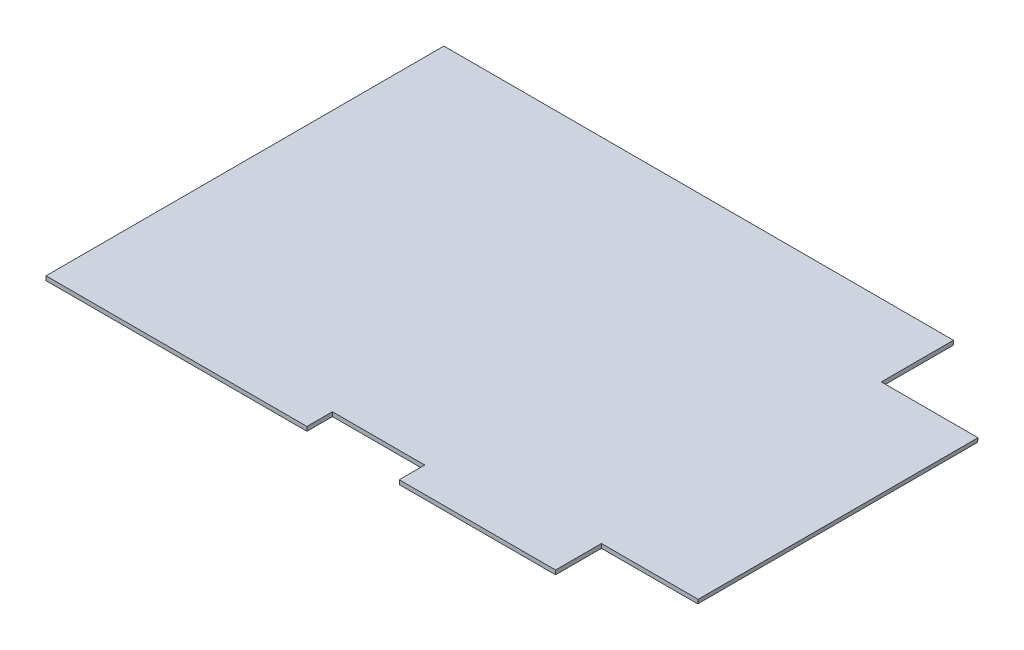
ISO-10303-21;
HEADER;
FILE_DESCRIPTION(('STEP AP214'),'2;1');
FILE_NAME('part.step','',(''),(''),'','','');
FILE_SCHEMA(('AUTOMOTIVE_DESIGN { 1 0 10303 214 1 1 1 1 }'));
ENDSEC;
DATA;
#1=APPLICATION_CONTEXT('core data for automotive mechanical design processes');
#2=APPLICATION_PROTOCOL_DEFINITION('international standard','automotive_design',2000,#1);
#3=PRODUCT_CONTEXT('',#1,'mechanical');
#4=PRODUCT('Part','Part','',(#3));
#5=PRODUCT_RELATED_PRODUCT_CATEGORY('part','',(#4));
#6=PRODUCT_DEFINITION_FORMATION('','',#4);
#7=PRODUCT_DEFINITION_CONTEXT('part definition',#1,'design');
#8=PRODUCT_DEFINITION('design','',#6,#7);
#9=PRODUCT_DEFINITION_SHAPE('','',#8);
#10=(LENGTH_UNIT() NAMED_UNIT(*) SI_UNIT(.MILLI.,.METRE.));
#11=(NAMED_UNIT(*) PLANE_ANGLE_UNIT() SI_UNIT($,.RADIAN.));
#12=(NAMED_UNIT(*) SI_UNIT($,.STERADIAN.) SOLID_ANGLE_UNIT());
#13=UNCERTAINTY_MEASURE_WITH_UNIT(LENGTH_MEASURE(1.E-05),#10,'distance_accuracy_value','');
#14=(GEOMETRIC_REPRESENTATION_CONTEXT(3) GLOBAL_UNCERTAINTY_ASSIGNED_CONTEXT((#13)) GLOBAL_UNIT_ASSIGNED_CONTEXT((#10,
#11,#12)) REPRESENTATION_CONTEXT('',''));
#15=CARTESIAN_POINT('',(0.,0.,0.));
#16=DIRECTION('',(0.,0.,1.));
#17=DIRECTION('',(1.,0.,0.));
#18=AXIS2_PLACEMENT_3D('',#15,#16,#17);
#19=CARTESIAN_POINT('',(0.,0.,91.));
#20=DIRECTION('',(0.,0.,1.));
#21=DIRECTION('',(1.,0.,0.));
#22=AXIS2_PLACEMENT_3D('',#19,#20,#21);
#23=PLANE('',#22);
#24=DIRECTION('',(0.,1.,0.));
#25=VECTOR('',#24,1.);
#26=CARTESIAN_POINT('',(26.9504804762211,-14.6783379848463,91.));
#27=LINE('',#26,#25);
#28=CARTESIAN_POINT('',(26.9504804762211,-5.6411425591385,91.));
#29=VERTEX_POINT('',#28);
#30=CARTESIAN_POINT('',(26.9504804762211,-4.67833798484632,91.));
#31=VERTEX_POINT('',#30);
#32=EDGE_CURVE('E149',#29,#31,#27,.T.);
#33=ORIENTED_EDGE('',*,*,#32,.F.);
#34=DIRECTION('',(1.,0.,0.));
#35=VECTOR('',#34,1.);
#36=CARTESIAN_POINT('',(0.,-5.6411425591385,91.));
#37=LINE('',#36,#35);
#38=CARTESIAN_POINT('',(62.6929174042532,-5.6411425591385,91.));
#39=VERTEX_POINT('',#38);
#40=EDGE_CURVE('E159',#29,#39,#37,.T.);
#41=ORIENTED_EDGE('',*,*,#40,.T.);
#42=DIRECTION('',(0.,-1.,0.));
#43=VECTOR('',#42,1.);
#44=CARTESIAN_POINT('',(62.6929174042532,0.,91.));
#45=LINE('',#44,#43);
#46=CARTESIAN_POINT('',(62.6929174042532,-4.67833798484632,91.));
#47=VERTEX_POINT('',#46);
#48=EDGE_CURVE('E184',#47,#39,#45,.T.);
#49=ORIENTED_EDGE('',*,*,#48,.F.);
#50=DIRECTION('',(1.,0.,0.));
#51=VECTOR('',#50,1.);
#52=CARTESIAN_POINT('',(0.,-4.67833798484632,91.));
#53=LINE('',#52,#51);
#54=EDGE_CURVE('E157',#31,#47,#53,.T.);
#55=ORIENTED_EDGE('',*,*,#54,.F.);
#56=EDGE_LOOP('',(#33,#41,#49,#55));
#57=FACE_BOUND('',#56,.T.);
#58=ADVANCED_FACE('F35',(#57),#23,.T.);
#59=CARTESIAN_POINT('',(0.,-4.67833798484632,91.));
#60=DIRECTION('',(0.,1.,0.));
#61=DIRECTION('',(0.,0.,1.));
#62=AXIS2_PLACEMENT_3D('',#59,#60,#61);
#63=PLANE('',#62);
#64=DIRECTION('',(-0.00813356916873561,0.,-0.999966921979211));
#65=VECTOR('',#64,1.);
#66=CARTESIAN_POINT('',(26.9504804762211,-4.67833798484632,91.));
#67=LINE('',#66,#65);
#68=CARTESIAN_POINT('',(26.9382797188911,-4.67833798484632,89.5));
#69=VERTEX_POINT('',#68);
#70=EDGE_CURVE('E150',#31,#69,#67,.T.);
#71=ORIENTED_EDGE('',*,*,#70,.F.);
#72=ORIENTED_EDGE('',*,*,#54,.T.);
#73=DIRECTION('',(0.,0.,1.));
#74=VECTOR('',#73,1.);
#75=CARTESIAN_POINT('',(62.6929174042532,-4.67833798484632,94.5));
#76=LINE('',#75,#74);
#77=CARTESIAN_POINT('',(62.6929174042532,-4.67833798484632,80.5));
#78=VERTEX_POINT('',#77);
#79=EDGE_CURVE('E221',#78,#47,#76,.T.);
#80=ORIENTED_EDGE('',*,*,#79,.F.);
#81=DIRECTION('',(-1.,0.,0.));
#82=VECTOR('',#81,1.);
#83=CARTESIAN_POINT('',(92.8153903754205,-4.67833798484632,80.5));
#84=LINE('',#83,#82);
#85=CARTESIAN_POINT('',(84.8047320824321,-4.67833798484632,80.5));
#86=VERTEX_POINT('',#85);
#87=EDGE_CURVE('E218',#86,#78,#84,.T.);
#88=ORIENTED_EDGE('',*,*,#87,.F.);
#89=DIRECTION('',(0.,0.,-1.));
#90=VECTOR('',#89,1.);
#91=CARTESIAN_POINT('',(84.8047320824321,-4.67833798484632,91.));
#92=LINE('',#91,#90);
#93=CARTESIAN_POINT('',(84.8047320824321,-4.67833798484632,16.5));
#94=VERTEX_POINT('',#93);
#95=EDGE_CURVE('E167',#86,#94,#92,.T.);
#96=ORIENTED_EDGE('',*,*,#95,.T.);
#97=DIRECTION('',(1.,0.,0.));
#98=VECTOR('',#97,1.);
#99=CARTESIAN_POINT('',(62.6929174042532,-4.67833798484632,16.5));
#100=LINE('',#99,#98);
#101=CARTESIAN_POINT('',(62.6929174042532,-4.67833798484632,16.5));
#102=VERTEX_POINT('',#101);
#103=EDGE_CURVE('E213',#102,#94,#100,.T.);
#104=ORIENTED_EDGE('',*,*,#103,.F.);
#105=DIRECTION('',(0.,0.,1.));
#106=VECTOR('',#105,1.);
#107=CARTESIAN_POINT('',(62.6929174042532,-4.67833798484632,2.49999999999999));
#108=LINE('',#107,#106);
#109=CARTESIAN_POINT('',(62.6929174042532,-4.67833798484632,0.));
#110=VERTEX_POINT('',#109);
#111=EDGE_CURVE('E210',#110,#102,#108,.T.);
#112=ORIENTED_EDGE('',*,*,#111,.F.);
#113=DIRECTION('',(1.,0.,0.));
#114=VECTOR('',#113,1.);
#115=CARTESIAN_POINT('',(0.,-4.67833798484632,0.));
#116=LINE('',#115,#114);
#117=CARTESIAN_POINT('',(-53.8398515265044,-4.67833798484632,0.));
#118=VERTEX_POINT('',#117);
#119=EDGE_CURVE('E168',#118,#110,#116,.T.);
#120=ORIENTED_EDGE('',*,*,#119,.F.);
#121=DIRECTION('',(0.,0.,-1.));
#122=VECTOR('',#121,1.);
#123=CARTESIAN_POINT('',(-53.8398515265044,-4.67833798484632,91.));
#124=LINE('',#123,#122);
#125=CARTESIAN_POINT('',(-53.8398515265044,-4.67833798484632,91.));
#126=VERTEX_POINT('',#125);
#127=EDGE_CURVE('E154',#126,#118,#124,.T.);
#128=ORIENTED_EDGE('',*,*,#127,.F.);
#129=CARTESIAN_POINT('',(5.83223887179792,-4.67833798484632,91.));
#130=VERTEX_POINT('',#129);
#131=EDGE_CURVE('E146',#126,#130,#53,.T.);
#132=ORIENTED_EDGE('',*,*,#131,.T.);
#133=DIRECTION('',(0.,0.,1.));
#134=VECTOR('',#133,1.);
#135=CARTESIAN_POINT('',(5.83223887179792,-4.67833798484632,89.5));
#136=LINE('',#135,#134);
#137=CARTESIAN_POINT('',(5.83223887179792,-4.67833798484632,85.1692979934994));
#138=VERTEX_POINT('',#137);
#139=EDGE_CURVE('E132',#138,#130,#136,.T.);
#140=ORIENTED_EDGE('',*,*,#139,.F.);
#141=DIRECTION('',(-1.,0.,0.));
#142=VECTOR('',#141,1.);
#143=CARTESIAN_POINT('',(26.9382797188911,-4.67833798484632,85.1692979934994));
#144=LINE('',#143,#142);
#145=CARTESIAN_POINT('',(26.9382797188911,-4.67833798484632,85.1692979934994));
#146=VERTEX_POINT('',#145);
#147=EDGE_CURVE('E141',#146,#138,#144,.T.);
#148=ORIENTED_EDGE('',*,*,#147,.F.);
#149=DIRECTION('',(0.,0.,-1.));
#150=VECTOR('',#149,1.);
#151=CARTESIAN_POINT('',(26.9382797188911,-4.67833798484632,89.5));
#152=LINE('',#151,#150);
#153=EDGE_CURVE('E50',#69,#146,#152,.T.);
#154=ORIENTED_EDGE('',*,*,#153,.F.);
#155=EDGE_LOOP('',(#71,#72,#80,#88,#96,#104,#112,#120,#128,#132,#140,#148,#154));
#156=FACE_BOUND('',#155,.T.);
#157=ADVANCED_FACE('F37',(#156),#63,.T.);
#158=CARTESIAN_POINT('',(-53.8398515265044,0.,91.));
#159=DIRECTION('',(1.,0.,0.));
#160=DIRECTION('',(0.,0.,-1.));
#161=AXIS2_PLACEMENT_3D('',#158,#159,#160);
#162=PLANE('',#161);
#163=DIRECTION('',(0.,-1.,0.));
#164=VECTOR('',#163,1.);
#165=CARTESIAN_POINT('',(-53.8398515265044,0.,0.));
#166=LINE('',#165,#164);
#167=CARTESIAN_POINT('',(-53.8398515265044,-5.6411425591385,0.));
#168=VERTEX_POINT('',#167);
#169=EDGE_CURVE('E171',#118,#168,#166,.T.);
#170=ORIENTED_EDGE('',*,*,#169,.T.);
#171=DIRECTION('',(0.,0.,-1.));
#172=VECTOR('',#171,1.);
#173=CARTESIAN_POINT('',(-53.8398515265044,-5.6411425591385,91.));
#174=LINE('',#173,#172);
#175=CARTESIAN_POINT('',(-53.8398515265044,-5.6411425591385,91.));
#176=VERTEX_POINT('',#175);
#177=EDGE_CURVE('E180',#176,#168,#174,.T.);
#178=ORIENTED_EDGE('',*,*,#177,.F.);
#179=DIRECTION('',(0.,-1.,0.));
#180=VECTOR('',#179,1.);
#181=CARTESIAN_POINT('',(-53.8398515265044,0.,91.));
#182=LINE('',#181,#180);
#183=EDGE_CURVE('E156',#126,#176,#182,.T.);
#184=ORIENTED_EDGE('',*,*,#183,.F.);
#185=ORIENTED_EDGE('',*,*,#127,.T.);
#186=EDGE_LOOP('',(#170,#178,#184,#185));
#187=FACE_BOUND('',#186,.T.);
#188=ADVANCED_FACE('F271',(#187),#162,.F.);
#189=CARTESIAN_POINT('',(0.,-5.6411425591385,91.));
#190=DIRECTION('',(0.,1.,0.));
#191=DIRECTION('',(0.,0.,1.));
#192=AXIS2_PLACEMENT_3D('',#189,#190,#191);
#193=PLANE('',#192);
#194=ORIENTED_EDGE('',*,*,#40,.F.);
#195=DIRECTION('',(-0.00813356916873561,0.,-0.999966921979211));
#196=VECTOR('',#195,1.);
#197=CARTESIAN_POINT('',(26.9486975686021,-5.6411425591385,90.7808036537371));
#198=LINE('',#197,#196);
#199=CARTESIAN_POINT('',(26.9382797188911,-5.6411425591385,89.5));
#200=VERTEX_POINT('',#199);
#201=EDGE_CURVE('E249',#29,#200,#198,.T.);
#202=ORIENTED_EDGE('',*,*,#201,.T.);
#203=DIRECTION('',(0.,0.,-1.));
#204=VECTOR('',#203,1.);
#205=CARTESIAN_POINT('',(26.9382797188911,-5.6411425591385,91.));
#206=LINE('',#205,#204);
#207=CARTESIAN_POINT('',(26.9382797188911,-5.6411425591385,85.1692979934994));
#208=VERTEX_POINT('',#207);
#209=EDGE_CURVE('E11',#200,#208,#206,.T.);
#210=ORIENTED_EDGE('',*,*,#209,.T.);
#211=DIRECTION('',(-1.,0.,0.));
#212=VECTOR('',#211,1.);
#213=CARTESIAN_POINT('',(0.,-5.6411425591385,85.1692979934994));
#214=LINE('',#213,#212);
#215=CARTESIAN_POINT('',(5.83223887179792,-5.6411425591385,85.1692979934994));
#216=VERTEX_POINT('',#215);
#217=EDGE_CURVE('E196',#208,#216,#214,.T.);
#218=ORIENTED_EDGE('',*,*,#217,.T.);
#219=DIRECTION('',(0.,0.,1.));
#220=VECTOR('',#219,1.);
#221=CARTESIAN_POINT('',(5.83223887179792,-5.6411425591385,91.));
#222=LINE('',#221,#220);
#223=CARTESIAN_POINT('',(5.83223887179792,-5.6411425591385,91.));
#224=VERTEX_POINT('',#223);
#225=EDGE_CURVE('E43',#216,#224,#222,.T.);
#226=ORIENTED_EDGE('',*,*,#225,.T.);
#227=EDGE_CURVE('E148',#176,#224,#37,.T.);
#228=ORIENTED_EDGE('',*,*,#227,.F.);
#229=ORIENTED_EDGE('',*,*,#177,.T.);
#230=DIRECTION('',(1.,0.,0.));
#231=VECTOR('',#230,1.);
#232=CARTESIAN_POINT('',(0.,-5.6411425591385,0.));
#233=LINE('',#232,#231);
#234=CARTESIAN_POINT('',(62.6929174042532,-5.6411425591385,0.));
#235=VERTEX_POINT('',#234);
#236=EDGE_CURVE('E161',#168,#235,#233,.T.);
#237=ORIENTED_EDGE('',*,*,#236,.T.);
#238=DIRECTION('',(0.,0.,1.));
#239=VECTOR('',#238,1.);
#240=CARTESIAN_POINT('',(62.6929174042532,-5.6411425591385,91.));
#241=LINE('',#240,#239);
#242=CARTESIAN_POINT('',(62.6929174042532,-5.6411425591385,16.5));
#243=VERTEX_POINT('',#242);
#244=EDGE_CURVE('E193',#235,#243,#241,.T.);
#245=ORIENTED_EDGE('',*,*,#244,.T.);
#246=DIRECTION('',(1.,0.,0.));
#247=VECTOR('',#246,1.);
#248=CARTESIAN_POINT('',(0.,-5.6411425591385,16.5));
#249=LINE('',#248,#247);
#250=CARTESIAN_POINT('',(84.7089553799947,-5.6411425591385,16.5));
#251=VERTEX_POINT('',#250);
#252=EDGE_CURVE('E163',#243,#251,#249,.T.);
#253=ORIENTED_EDGE('',*,*,#252,.T.);
#254=DIRECTION('',(0.,0.,-1.));
#255=VECTOR('',#254,1.);
#256=CARTESIAN_POINT('',(84.7089553799947,-5.6411425591385,91.));
#257=LINE('',#256,#255);
#258=CARTESIAN_POINT('',(84.7089553799947,-5.6411425591385,80.5));
#259=VERTEX_POINT('',#258);
#260=EDGE_CURVE('E177',#259,#251,#257,.T.);
#261=ORIENTED_EDGE('',*,*,#260,.F.);
#262=DIRECTION('',(-1.,0.,0.));
#263=VECTOR('',#262,1.);
#264=CARTESIAN_POINT('',(0.,-5.6411425591385,80.5));
#265=LINE('',#264,#263);
#266=CARTESIAN_POINT('',(62.6929174042532,-5.6411425591385,80.5));
#267=VERTEX_POINT('',#266);
#268=EDGE_CURVE('E228',#259,#267,#265,.T.);
#269=ORIENTED_EDGE('',*,*,#268,.T.);
#270=DIRECTION('',(0.,0.,1.));
#271=VECTOR('',#270,1.);
#272=CARTESIAN_POINT('',(62.6929174042532,-5.6411425591385,91.));
#273=LINE('',#272,#271);
#274=EDGE_CURVE('E226',#267,#39,#273,.T.);
#275=ORIENTED_EDGE('',*,*,#274,.T.);
#276=EDGE_LOOP('',(#194,#202,#210,#218,#226,#228,#229,#237,#245,#253,#261,#269,#275));
#277=FACE_BOUND('',#276,.T.);
#278=ADVANCED_FACE('F200',(#277),#193,.F.);
#279=CARTESIAN_POINT('',(84.4345846468423,-8.39928091855411,91.));
#280=DIRECTION('',(-0.995088605842048,0.0989882140627348,0.));
#281=DIRECTION('',(-0.0989882140627348,-0.995088605842048,0.));
#282=AXIS2_PLACEMENT_3D('',#279,#280,#281);
#283=PLANE('',#282);
#284=ORIENTED_EDGE('',*,*,#260,.T.);
#285=DIRECTION('',(0.0989882140627348,0.995088605842048,0.));
#286=VECTOR('',#285,1.);
#287=CARTESIAN_POINT('',(84.4345846468423,-8.39928091855411,16.5));
#288=LINE('',#287,#286);
#289=EDGE_CURVE('E190',#251,#94,#288,.T.);
#290=ORIENTED_EDGE('',*,*,#289,.T.);
#291=ORIENTED_EDGE('',*,*,#95,.F.);
#292=DIRECTION('',(-0.0989882140627348,-0.995088605842048,0.));
#293=VECTOR('',#292,1.);
#294=CARTESIAN_POINT('',(84.4345846468423,-8.39928091855411,80.5));
#295=LINE('',#294,#293);
#296=EDGE_CURVE('E187',#86,#259,#295,.T.);
#297=ORIENTED_EDGE('',*,*,#296,.T.);
#298=EDGE_LOOP('',(#284,#290,#291,#297));
#299=FACE_BOUND('',#298,.T.);
#300=ADVANCED_FACE('F235',(#299),#283,.F.);
#301=DIRECTION('',(0.,1.,0.));
#302=VECTOR('',#301,1.);
#303=CARTESIAN_POINT('',(5.83223887179792,-14.6783379848463,91.));
#304=LINE('',#303,#302);
#305=EDGE_CURVE('E135',#224,#130,#304,.T.);
#306=ORIENTED_EDGE('',*,*,#305,.T.);
#307=ORIENTED_EDGE('',*,*,#131,.F.);
#308=ORIENTED_EDGE('',*,*,#183,.T.);
#309=ORIENTED_EDGE('',*,*,#227,.T.);
#310=EDGE_LOOP('',(#306,#307,#308,#309));
#311=FACE_BOUND('',#310,.T.);
#312=ADVANCED_FACE('F145',(#311),#23,.T.);
#313=CARTESIAN_POINT('',(0.,0.,0.));
#314=DIRECTION('',(0.,0.,1.));
#315=DIRECTION('',(1.,0.,0.));
#316=AXIS2_PLACEMENT_3D('',#313,#314,#315);
#317=PLANE('',#316);
#318=ORIENTED_EDGE('',*,*,#119,.T.);
#319=DIRECTION('',(0.,1.,0.));
#320=VECTOR('',#319,1.);
#321=CARTESIAN_POINT('',(62.6929174042532,-14.6783379848463,0.));
#322=LINE('',#321,#320);
#323=EDGE_CURVE('E222',#235,#110,#322,.T.);
#324=ORIENTED_EDGE('',*,*,#323,.F.);
#325=ORIENTED_EDGE('',*,*,#236,.F.);
#326=ORIENTED_EDGE('',*,*,#169,.F.);
#327=EDGE_LOOP('',(#318,#324,#325,#326));
#328=FACE_BOUND('',#327,.T.);
#329=ADVANCED_FACE('F275',(#328),#317,.F.);
#330=CARTESIAN_POINT('',(92.8153903754205,-95.6783379848463,80.5));
#331=DIRECTION('',(0.,0.,-1.));
#332=DIRECTION('',(-1.,0.,0.));
#333=AXIS2_PLACEMENT_3D('',#330,#331,#332);
#334=PLANE('',#333);
#335=ORIENTED_EDGE('',*,*,#296,.F.);
#336=ORIENTED_EDGE('',*,*,#87,.T.);
#337=DIRECTION('',(0.,1.,0.));
#338=VECTOR('',#337,1.);
#339=CARTESIAN_POINT('',(62.6929174042532,-95.6783379848463,80.5));
#340=LINE('',#339,#338);
#341=EDGE_CURVE('E214',#267,#78,#340,.T.);
#342=ORIENTED_EDGE('',*,*,#341,.F.);
#343=ORIENTED_EDGE('',*,*,#268,.F.);
#344=EDGE_LOOP('',(#335,#336,#342,#343));
#345=FACE_BOUND('',#344,.T.);
#346=ADVANCED_FACE('F239',(#345),#334,.F.);
#347=CARTESIAN_POINT('',(62.6929174042532,-95.6783379848463,94.5));
#348=DIRECTION('',(-1.,0.,0.));
#349=DIRECTION('',(0.,0.,1.));
#350=AXIS2_PLACEMENT_3D('',#347,#348,#349);
#351=PLANE('',#350);
#352=ORIENTED_EDGE('',*,*,#341,.T.);
#353=ORIENTED_EDGE('',*,*,#79,.T.);
#354=ORIENTED_EDGE('',*,*,#48,.T.);
#355=ORIENTED_EDGE('',*,*,#274,.F.);
#356=EDGE_LOOP('',(#352,#353,#354,#355));
#357=FACE_BOUND('',#356,.T.);
#358=ADVANCED_FACE('F246',(#357),#351,.F.);
#359=CARTESIAN_POINT('',(62.6929174042532,-95.6783379848463,2.49999999999999));
#360=DIRECTION('',(-1.,0.,0.));
#361=DIRECTION('',(0.,0.,1.));
#362=AXIS2_PLACEMENT_3D('',#359,#360,#361);
#363=PLANE('',#362);
#364=ORIENTED_EDGE('',*,*,#244,.F.);
#365=ORIENTED_EDGE('',*,*,#323,.T.);
#366=ORIENTED_EDGE('',*,*,#111,.T.);
#367=DIRECTION('',(0.,1.,0.));
#368=VECTOR('',#367,1.);
#369=CARTESIAN_POINT('',(62.6929174042532,-95.6783379848463,16.5));
#370=LINE('',#369,#368);
#371=EDGE_CURVE('E216',#243,#102,#370,.T.);
#372=ORIENTED_EDGE('',*,*,#371,.F.);
#373=EDGE_LOOP('',(#364,#365,#366,#372));
#374=FACE_BOUND('',#373,.T.);
#375=ADVANCED_FACE('F295',(#374),#363,.F.);
#376=CARTESIAN_POINT('',(62.6929174042532,-95.6783379848463,16.5));
#377=DIRECTION('',(0.,0.,1.));
#378=DIRECTION('',(1.,0.,0.));
#379=AXIS2_PLACEMENT_3D('',#376,#377,#378);
#380=PLANE('',#379);
#381=ORIENTED_EDGE('',*,*,#371,.T.);
#382=ORIENTED_EDGE('',*,*,#103,.T.);
#383=ORIENTED_EDGE('',*,*,#289,.F.);
#384=ORIENTED_EDGE('',*,*,#252,.F.);
#385=EDGE_LOOP('',(#381,#382,#383,#384));
#386=FACE_BOUND('',#385,.T.);
#387=ADVANCED_FACE('F296',(#386),#380,.F.);
#388=CARTESIAN_POINT('',(26.9382797188911,-95.6783379848463,89.5));
#389=DIRECTION('',(1.,0.,0.));
#390=DIRECTION('',(0.,0.,-1.));
#391=AXIS2_PLACEMENT_3D('',#388,#389,#390);
#392=PLANE('',#391);
#393=DIRECTION('',(0.,1.,0.));
#394=VECTOR('',#393,1.);
#395=CARTESIAN_POINT('',(26.9382797188911,-95.6783379848463,89.5));
#396=LINE('',#395,#394);
#397=EDGE_CURVE('E206',#200,#69,#396,.T.);
#398=ORIENTED_EDGE('',*,*,#397,.T.);
#399=ORIENTED_EDGE('',*,*,#153,.T.);
#400=DIRECTION('',(0.,1.,0.));
#401=VECTOR('',#400,1.);
#402=CARTESIAN_POINT('',(26.9382797188911,-95.6783379848463,85.1692979934994));
#403=LINE('',#402,#401);
#404=EDGE_CURVE('E140',#208,#146,#403,.T.);
#405=ORIENTED_EDGE('',*,*,#404,.F.);
#406=ORIENTED_EDGE('',*,*,#209,.F.);
#407=EDGE_LOOP('',(#398,#399,#405,#406));
#408=FACE_BOUND('',#407,.T.);
#409=ADVANCED_FACE('F204',(#408),#392,.F.);
#410=CARTESIAN_POINT('',(5.83223887179792,-95.6783379848463,89.5));
#411=DIRECTION('',(-1.,0.,0.));
#412=DIRECTION('',(0.,0.,1.));
#413=AXIS2_PLACEMENT_3D('',#410,#411,#412);
#414=PLANE('',#413);
#415=DIRECTION('',(0.,1.,0.));
#416=VECTOR('',#415,1.);
#417=CARTESIAN_POINT('',(5.83223887179792,-95.6783379848463,85.1692979934994));
#418=LINE('',#417,#416);
#419=EDGE_CURVE('E58',#216,#138,#418,.T.);
#420=ORIENTED_EDGE('',*,*,#419,.T.);
#421=ORIENTED_EDGE('',*,*,#139,.T.);
#422=ORIENTED_EDGE('',*,*,#305,.F.);
#423=ORIENTED_EDGE('',*,*,#225,.F.);
#424=EDGE_LOOP('',(#420,#421,#422,#423));
#425=FACE_BOUND('',#424,.T.);
#426=ADVANCED_FACE('F134',(#425),#414,.F.);
#427=CARTESIAN_POINT('',(26.9382797188911,-95.6783379848463,85.1692979934994));
#428=DIRECTION('',(0.,0.,-1.));
#429=DIRECTION('',(-1.,0.,0.));
#430=AXIS2_PLACEMENT_3D('',#427,#428,#429);
#431=PLANE('',#430);
#432=ORIENTED_EDGE('',*,*,#404,.T.);
#433=ORIENTED_EDGE('',*,*,#147,.T.);
#434=ORIENTED_EDGE('',*,*,#419,.F.);
#435=ORIENTED_EDGE('',*,*,#217,.F.);
#436=EDGE_LOOP('',(#432,#433,#434,#435));
#437=FACE_BOUND('',#436,.T.);
#438=ADVANCED_FACE('F203',(#437),#431,.F.);
#439=CARTESIAN_POINT('',(26.9504804762211,-14.6783379848463,91.));
#440=DIRECTION('',(0.999966921979211,0.,-0.00813356916873561));
#441=DIRECTION('',(-0.00813356916873561,0.,-0.999966921979211));
#442=AXIS2_PLACEMENT_3D('',#439,#440,#441);
#443=PLANE('',#442);
#444=ORIENTED_EDGE('',*,*,#32,.T.);
#445=ORIENTED_EDGE('',*,*,#70,.T.);
#446=ORIENTED_EDGE('',*,*,#397,.F.);
#447=ORIENTED_EDGE('',*,*,#201,.F.);
#448=EDGE_LOOP('',(#444,#445,#446,#447));
#449=FACE_BOUND('',#448,.T.);
#450=ADVANCED_FACE('F258',(#449),#443,.F.);
#451=CLOSED_SHELL('',(#58,#157,#188,#278,#300,#312,#329,#346,#358,#375,#387,#409,#426,#438,#450));
#452=MANIFOLD_SOLID_BREP('B2',#451);
#453=ADVANCED_BREP_SHAPE_REPRESENTATION('',(#18,#452),#14);
#454=SHAPE_DEFINITION_REPRESENTATION(#9,#453);
ENDSEC;
END-ISO-10303-21;
